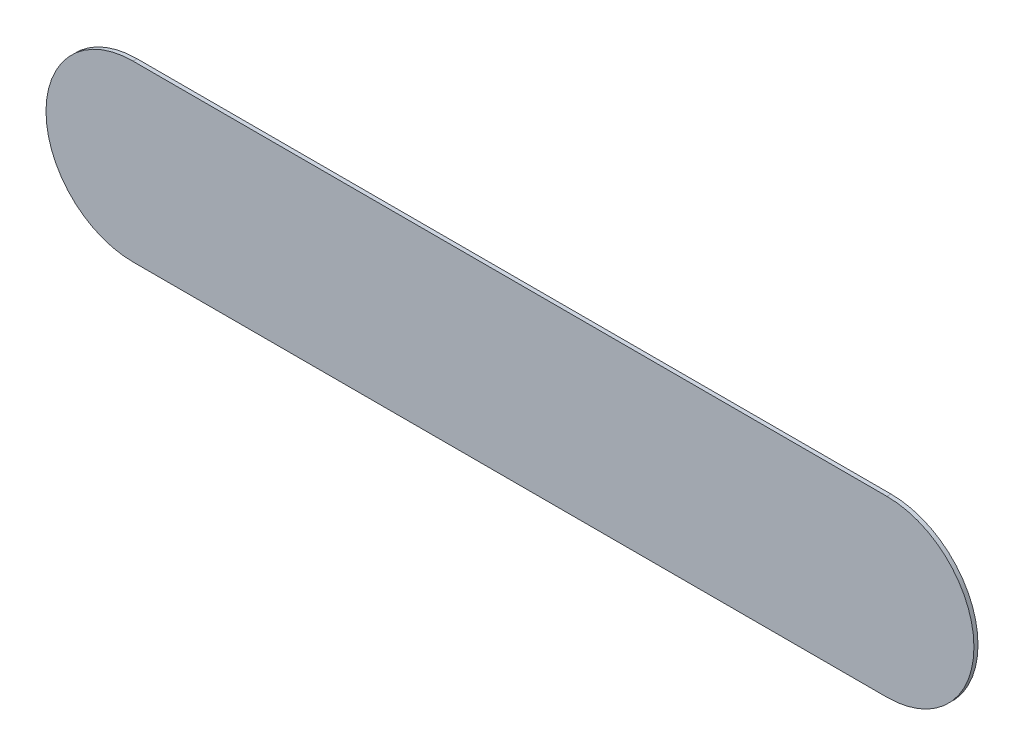
ISO-10303-21;
HEADER;
FILE_DESCRIPTION(('STEP AP214'),'2;1');
FILE_NAME('part.step','',(''),(''),'','','');
FILE_SCHEMA(('AUTOMOTIVE_DESIGN { 1 0 10303 214 1 1 1 1 }'));
ENDSEC;
DATA;
#1=APPLICATION_CONTEXT('core data for automotive mechanical design processes');
#2=APPLICATION_PROTOCOL_DEFINITION('international standard','automotive_design',2000,#1);
#3=PRODUCT_CONTEXT('',#1,'mechanical');
#4=PRODUCT('Part','Part','',(#3));
#5=PRODUCT_RELATED_PRODUCT_CATEGORY('part','',(#4));
#6=PRODUCT_DEFINITION_FORMATION('','',#4);
#7=PRODUCT_DEFINITION_CONTEXT('part definition',#1,'design');
#8=PRODUCT_DEFINITION('design','',#6,#7);
#9=PRODUCT_DEFINITION_SHAPE('','',#8);
#10=(LENGTH_UNIT() NAMED_UNIT(*) SI_UNIT(.MILLI.,.METRE.));
#11=(NAMED_UNIT(*) PLANE_ANGLE_UNIT() SI_UNIT($,.RADIAN.));
#12=(NAMED_UNIT(*) SI_UNIT($,.STERADIAN.) SOLID_ANGLE_UNIT());
#13=UNCERTAINTY_MEASURE_WITH_UNIT(LENGTH_MEASURE(1.E-05),#10,'distance_accuracy_value','');
#14=(GEOMETRIC_REPRESENTATION_CONTEXT(3) GLOBAL_UNCERTAINTY_ASSIGNED_CONTEXT((#13)) GLOBAL_UNIT_ASSIGNED_CONTEXT((#10,
#11,#12)) REPRESENTATION_CONTEXT('',''));
#15=CARTESIAN_POINT('',(0.,0.,0.));
#16=DIRECTION('',(0.,0.,1.));
#17=DIRECTION('',(1.,0.,0.));
#18=AXIS2_PLACEMENT_3D('',#15,#16,#17);
#19=CARTESIAN_POINT('',(20.75,-7.5,1.635));
#20=DIRECTION('',(0.,0.,1.));
#21=DIRECTION('',(1.,0.,0.));
#22=AXIS2_PLACEMENT_3D('',#19,#20,#21);
#23=PLANE('',#22);
#24=DIRECTION('',(1.,0.,0.));
#25=VECTOR('',#24,1.);
#26=CARTESIAN_POINT('',(20.75,-7.5,1.635));
#27=LINE('',#26,#25);
#28=CARTESIAN_POINT('',(20.75,-7.5,1.635));
#29=VERTEX_POINT('',#28);
#30=CARTESIAN_POINT('',(27.25,-7.5,1.635));
#31=VERTEX_POINT('',#30);
#32=EDGE_CURVE('E87',#29,#31,#27,.T.);
#33=ORIENTED_EDGE('',*,*,#32,.T.);
#34=CARTESIAN_POINT('',(27.25,-6.75,1.635));
#35=DIRECTION('',(0.,0.,1.));
#36=DIRECTION('',(0.,-1.,0.));
#37=AXIS2_PLACEMENT_3D('',#34,#35,#36);
#38=CIRCLE('',#37,0.75);
#39=CARTESIAN_POINT('',(27.25,-6.,1.635));
#40=VERTEX_POINT('',#39);
#41=EDGE_CURVE('E61',#31,#40,#38,.T.);
#42=ORIENTED_EDGE('',*,*,#41,.T.);
#43=DIRECTION('',(-1.,0.,0.));
#44=VECTOR('',#43,1.);
#45=CARTESIAN_POINT('',(27.25,-6.,1.635));
#46=LINE('',#45,#44);
#47=CARTESIAN_POINT('',(20.75,-6.,1.635));
#48=VERTEX_POINT('',#47);
#49=EDGE_CURVE('E80',#40,#48,#46,.T.);
#50=ORIENTED_EDGE('',*,*,#49,.T.);
#51=CARTESIAN_POINT('',(20.75,-6.75,1.635));
#52=DIRECTION('',(0.,0.,1.));
#53=DIRECTION('',(0.,1.,0.));
#54=AXIS2_PLACEMENT_3D('',#51,#52,#53);
#55=CIRCLE('',#54,0.75);
#56=EDGE_CURVE('E11',#48,#29,#55,.T.);
#57=ORIENTED_EDGE('',*,*,#56,.T.);
#58=EDGE_LOOP('',(#33,#42,#50,#57));
#59=FACE_BOUND('',#58,.T.);
#60=ADVANCED_FACE('F16',(#59),#23,.T.);
#61=CARTESIAN_POINT('',(20.75,-7.5,1.6));
#62=DIRECTION('',(0.,0.,1.));
#63=DIRECTION('',(1.,0.,0.));
#64=AXIS2_PLACEMENT_3D('',#61,#62,#63);
#65=PLANE('',#64);
#66=CARTESIAN_POINT('',(20.75,-6.75,1.6));
#67=DIRECTION('',(0.,0.,1.));
#68=DIRECTION('',(0.,1.,0.));
#69=AXIS2_PLACEMENT_3D('',#66,#67,#68);
#70=CIRCLE('',#69,0.75);
#71=CARTESIAN_POINT('',(20.75,-6.,1.6));
#72=VERTEX_POINT('',#71);
#73=CARTESIAN_POINT('',(20.75,-7.5,1.6));
#74=VERTEX_POINT('',#73);
#75=EDGE_CURVE('E27',#72,#74,#70,.T.);
#76=ORIENTED_EDGE('',*,*,#75,.F.);
#77=DIRECTION('',(-1.,0.,0.));
#78=VECTOR('',#77,1.);
#79=CARTESIAN_POINT('',(27.25,-6.,1.6));
#80=LINE('',#79,#78);
#81=CARTESIAN_POINT('',(27.25,-6.,1.6));
#82=VERTEX_POINT('',#81);
#83=EDGE_CURVE('E74',#82,#72,#80,.T.);
#84=ORIENTED_EDGE('',*,*,#83,.F.);
#85=CARTESIAN_POINT('',(27.25,-6.75,1.6));
#86=DIRECTION('',(0.,0.,1.));
#87=DIRECTION('',(0.,-1.,0.));
#88=AXIS2_PLACEMENT_3D('',#85,#86,#87);
#89=CIRCLE('',#88,0.75);
#90=CARTESIAN_POINT('',(27.25,-7.5,1.6));
#91=VERTEX_POINT('',#90);
#92=EDGE_CURVE('E92',#91,#82,#89,.T.);
#93=ORIENTED_EDGE('',*,*,#92,.F.);
#94=DIRECTION('',(1.,0.,0.));
#95=VECTOR('',#94,1.);
#96=CARTESIAN_POINT('',(20.75,-7.5,1.6));
#97=LINE('',#96,#95);
#98=EDGE_CURVE('E20',#74,#91,#97,.T.);
#99=ORIENTED_EDGE('',*,*,#98,.F.);
#100=EDGE_LOOP('',(#76,#84,#93,#99));
#101=FACE_BOUND('',#100,.T.);
#102=ADVANCED_FACE('F116',(#101),#65,.F.);
#103=CARTESIAN_POINT('',(20.75,-6.75,1.6));
#104=DIRECTION('',(0.,0.,-1.));
#105=DIRECTION('',(0.,1.,0.));
#106=AXIS2_PLACEMENT_3D('',#103,#104,#105);
#107=CYLINDRICAL_SURFACE('',#106,0.75);
#108=ORIENTED_EDGE('',*,*,#75,.T.);
#109=DIRECTION('',(0.,0.,1.));
#110=VECTOR('',#109,1.);
#111=CARTESIAN_POINT('',(20.75,-7.5,1.6));
#112=LINE('',#111,#110);
#113=EDGE_CURVE('E99',#74,#29,#112,.T.);
#114=ORIENTED_EDGE('',*,*,#113,.T.);
#115=ORIENTED_EDGE('',*,*,#56,.F.);
#116=DIRECTION('',(0.,0.,1.));
#117=VECTOR('',#116,1.);
#118=CARTESIAN_POINT('',(20.75,-6.,1.6));
#119=LINE('',#118,#117);
#120=EDGE_CURVE('E83',#72,#48,#119,.T.);
#121=ORIENTED_EDGE('',*,*,#120,.F.);
#122=EDGE_LOOP('',(#108,#114,#115,#121));
#123=FACE_BOUND('',#122,.T.);
#124=ADVANCED_FACE('F109',(#123),#107,.T.);
#125=CARTESIAN_POINT('',(27.25,-6.,1.6));
#126=DIRECTION('',(0.,-1.,0.));
#127=DIRECTION('',(0.,0.,-1.));
#128=AXIS2_PLACEMENT_3D('',#125,#126,#127);
#129=PLANE('',#128);
#130=ORIENTED_EDGE('',*,*,#83,.T.);
#131=ORIENTED_EDGE('',*,*,#120,.T.);
#132=ORIENTED_EDGE('',*,*,#49,.F.);
#133=DIRECTION('',(0.,0.,1.));
#134=VECTOR('',#133,1.);
#135=CARTESIAN_POINT('',(27.25,-6.,1.6));
#136=LINE('',#135,#134);
#137=EDGE_CURVE('E81',#82,#40,#136,.T.);
#138=ORIENTED_EDGE('',*,*,#137,.F.);
#139=EDGE_LOOP('',(#130,#131,#132,#138));
#140=FACE_BOUND('',#139,.T.);
#141=ADVANCED_FACE('F18',(#140),#129,.F.);
#142=CARTESIAN_POINT('',(27.25,-6.75,1.6));
#143=DIRECTION('',(0.,0.,-1.));
#144=DIRECTION('',(0.,-1.,0.));
#145=AXIS2_PLACEMENT_3D('',#142,#143,#144);
#146=CYLINDRICAL_SURFACE('',#145,0.75);
#147=ORIENTED_EDGE('',*,*,#92,.T.);
#148=ORIENTED_EDGE('',*,*,#137,.T.);
#149=ORIENTED_EDGE('',*,*,#41,.F.);
#150=DIRECTION('',(0.,0.,1.));
#151=VECTOR('',#150,1.);
#152=CARTESIAN_POINT('',(27.25,-7.5,1.6));
#153=LINE('',#152,#151);
#154=EDGE_CURVE('E103',#91,#31,#153,.T.);
#155=ORIENTED_EDGE('',*,*,#154,.F.);
#156=EDGE_LOOP('',(#147,#148,#149,#155));
#157=FACE_BOUND('',#156,.T.);
#158=ADVANCED_FACE('F91',(#157),#146,.T.);
#159=CARTESIAN_POINT('',(20.75,-7.5,1.6));
#160=DIRECTION('',(0.,1.,0.));
#161=DIRECTION('',(1.,0.,0.));
#162=AXIS2_PLACEMENT_3D('',#159,#160,#161);
#163=PLANE('',#162);
#164=ORIENTED_EDGE('',*,*,#98,.T.);
#165=ORIENTED_EDGE('',*,*,#154,.T.);
#166=ORIENTED_EDGE('',*,*,#32,.F.);
#167=ORIENTED_EDGE('',*,*,#113,.F.);
#168=EDGE_LOOP('',(#164,#165,#166,#167));
#169=FACE_BOUND('',#168,.T.);
#170=ADVANCED_FACE('F113',(#169),#163,.F.);
#171=CLOSED_SHELL('',(#60,#102,#124,#141,#158,#170));
#172=MANIFOLD_SOLID_BREP('B1',#171);
#173=ADVANCED_BREP_SHAPE_REPRESENTATION('',(#18,#172),#14);
#174=SHAPE_DEFINITION_REPRESENTATION(#9,#173);
ENDSEC;
END-ISO-10303-21;
